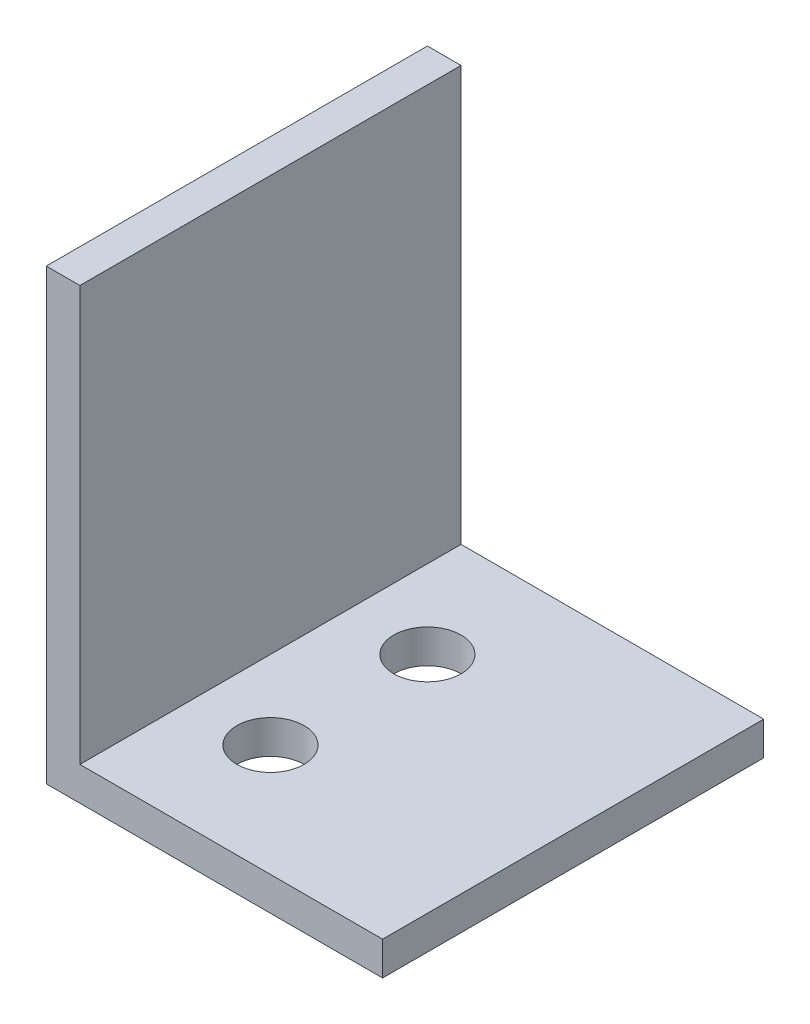
ISO-10303-21;
HEADER;
FILE_DESCRIPTION(('STEP AP214'),'2;1');
FILE_NAME('part.step','',(''),(''),'','','');
FILE_SCHEMA(('AUTOMOTIVE_DESIGN { 1 0 10303 214 1 1 1 1 }'));
ENDSEC;
DATA;
#1=APPLICATION_CONTEXT('core data for automotive mechanical design processes');
#2=APPLICATION_PROTOCOL_DEFINITION('international standard','automotive_design',2000,#1);
#3=PRODUCT_CONTEXT('',#1,'mechanical');
#4=PRODUCT('Part','Part','',(#3));
#5=PRODUCT_RELATED_PRODUCT_CATEGORY('part','',(#4));
#6=PRODUCT_DEFINITION_FORMATION('','',#4);
#7=PRODUCT_DEFINITION_CONTEXT('part definition',#1,'design');
#8=PRODUCT_DEFINITION('design','',#6,#7);
#9=PRODUCT_DEFINITION_SHAPE('','',#8);
#10=(LENGTH_UNIT() NAMED_UNIT(*) SI_UNIT(.MILLI.,.METRE.));
#11=(NAMED_UNIT(*) PLANE_ANGLE_UNIT() SI_UNIT($,.RADIAN.));
#12=(NAMED_UNIT(*) SI_UNIT($,.STERADIAN.) SOLID_ANGLE_UNIT());
#13=UNCERTAINTY_MEASURE_WITH_UNIT(LENGTH_MEASURE(1.E-05),#10,'distance_accuracy_value','');
#14=(GEOMETRIC_REPRESENTATION_CONTEXT(3) GLOBAL_UNCERTAINTY_ASSIGNED_CONTEXT((#13)) GLOBAL_UNIT_ASSIGNED_CONTEXT((#10,
#11,#12)) REPRESENTATION_CONTEXT('',''));
#15=CARTESIAN_POINT('',(0.,0.,0.));
#16=DIRECTION('',(0.,0.,1.));
#17=DIRECTION('',(1.,0.,0.));
#18=AXIS2_PLACEMENT_3D('',#15,#16,#17);
#19=CARTESIAN_POINT('',(-21.6132653272042,4.31884210526316,17.));
#20=DIRECTION('',(0.,-1.,0.));
#21=DIRECTION('',(0.,0.,-1.));
#22=AXIS2_PLACEMENT_3D('',#19,#20,#21);
#23=PLANE('',#22);
#24=DIRECTION('',(-1.,0.,0.));
#25=VECTOR('',#24,1.);
#26=CARTESIAN_POINT('',(-21.6132653272042,4.31884210526316,0.));
#27=LINE('',#26,#25);
#28=CARTESIAN_POINT('',(-21.6132653272042,4.31884210526316,0.));
#29=VERTEX_POINT('',#28);
#30=CARTESIAN_POINT('',(-23.1132653272042,4.31884210526316,0.));
#31=VERTEX_POINT('',#30);
#32=EDGE_CURVE('E114',#29,#31,#27,.T.);
#33=ORIENTED_EDGE('',*,*,#32,.T.);
#34=DIRECTION('',(0.,0.,-1.));
#35=VECTOR('',#34,1.);
#36=CARTESIAN_POINT('',(-23.1132653272042,4.31884210526316,17.));
#37=LINE('',#36,#35);
#38=CARTESIAN_POINT('',(-23.1132653272042,4.31884210526316,17.));
#39=VERTEX_POINT('',#38);
#40=EDGE_CURVE('E11',#39,#31,#37,.T.);
#41=ORIENTED_EDGE('',*,*,#40,.F.);
#42=DIRECTION('',(-1.,0.,0.));
#43=VECTOR('',#42,1.);
#44=CARTESIAN_POINT('',(-21.6132653272042,4.31884210526316,17.));
#45=LINE('',#44,#43);
#46=CARTESIAN_POINT('',(-21.6132653272042,4.31884210526316,17.));
#47=VERTEX_POINT('',#46);
#48=EDGE_CURVE('E125',#47,#39,#45,.T.);
#49=ORIENTED_EDGE('',*,*,#48,.F.);
#50=DIRECTION('',(0.,0.,-1.));
#51=VECTOR('',#50,1.);
#52=CARTESIAN_POINT('',(-21.6132653272042,4.31884210526316,17.));
#53=LINE('',#52,#51);
#54=EDGE_CURVE('E110',#47,#29,#53,.T.);
#55=ORIENTED_EDGE('',*,*,#54,.T.);
#56=EDGE_LOOP('',(#33,#41,#49,#55));
#57=FACE_BOUND('',#56,.T.);
#58=ADVANCED_FACE('F30',(#57),#23,.F.);
#59=CARTESIAN_POINT('',(-23.1132653272042,4.31884210526316,17.));
#60=DIRECTION('',(1.,0.,0.));
#61=DIRECTION('',(0.,1.,0.));
#62=AXIS2_PLACEMENT_3D('',#59,#60,#61);
#63=PLANE('',#62);
#64=DIRECTION('',(0.,-1.,0.));
#65=VECTOR('',#64,1.);
#66=CARTESIAN_POINT('',(-23.1132653272042,4.31884210526316,0.));
#67=LINE('',#66,#65);
#68=CARTESIAN_POINT('',(-23.1132653272042,-15.6811578947368,0.));
#69=VERTEX_POINT('',#68);
#70=EDGE_CURVE('E117',#31,#69,#67,.T.);
#71=ORIENTED_EDGE('',*,*,#70,.T.);
#72=DIRECTION('',(0.,0.,-1.));
#73=VECTOR('',#72,1.);
#74=CARTESIAN_POINT('',(-23.1132653272042,-15.6811578947368,17.));
#75=LINE('',#74,#73);
#76=CARTESIAN_POINT('',(-23.1132653272042,-15.6811578947368,17.));
#77=VERTEX_POINT('',#76);
#78=EDGE_CURVE('E38',#77,#69,#75,.T.);
#79=ORIENTED_EDGE('',*,*,#78,.F.);
#80=DIRECTION('',(0.,-1.,0.));
#81=VECTOR('',#80,1.);
#82=CARTESIAN_POINT('',(-23.1132653272042,4.31884210526316,17.));
#83=LINE('',#82,#81);
#84=EDGE_CURVE('E83',#39,#77,#83,.T.);
#85=ORIENTED_EDGE('',*,*,#84,.F.);
#86=ORIENTED_EDGE('',*,*,#40,.T.);
#87=EDGE_LOOP('',(#71,#79,#85,#86));
#88=FACE_BOUND('',#87,.T.);
#89=ADVANCED_FACE('F150',(#88),#63,.F.);
#90=CARTESIAN_POINT('',(-23.1132653272042,-15.6811578947368,17.));
#91=DIRECTION('',(0.,1.,0.));
#92=DIRECTION('',(0.,0.,1.));
#93=AXIS2_PLACEMENT_3D('',#90,#91,#92);
#94=PLANE('',#93);
#95=CARTESIAN_POINT('',(-18.1132653272042,-15.6811578947368,5.));
#96=DIRECTION('',(0.,1.,0.));
#97=DIRECTION('',(0.,0.,1.));
#98=AXIS2_PLACEMENT_3D('',#95,#96,#97);
#99=CIRCLE('',#98,1.5);
#100=CARTESIAN_POINT('',(-18.1132653272042,-15.6811578947368,6.5));
#101=VERTEX_POINT('',#100);
#102=EDGE_CURVE('E218',#101,#101,#99,.T.);
#103=ORIENTED_EDGE('',*,*,#102,.T.);
#104=EDGE_LOOP('',(#103));
#105=FACE_BOUND('',#104,.T.);
#106=CARTESIAN_POINT('',(-18.1132653272042,-15.6811578947368,12.));
#107=DIRECTION('',(0.,1.,0.));
#108=DIRECTION('',(0.,0.,1.));
#109=AXIS2_PLACEMENT_3D('',#106,#107,#108);
#110=CIRCLE('',#109,1.5);
#111=CARTESIAN_POINT('',(-18.1132653272042,-15.6811578947368,13.5));
#112=VERTEX_POINT('',#111);
#113=EDGE_CURVE('E118',#112,#112,#110,.T.);
#114=ORIENTED_EDGE('',*,*,#113,.T.);
#115=EDGE_LOOP('',(#114));
#116=FACE_BOUND('',#115,.T.);
#117=DIRECTION('',(1.,0.,0.));
#118=VECTOR('',#117,1.);
#119=CARTESIAN_POINT('',(-23.1132653272042,-15.6811578947368,0.));
#120=LINE('',#119,#118);
#121=CARTESIAN_POINT('',(-8.11326532720418,-15.6811578947368,0.));
#122=VERTEX_POINT('',#121);
#123=EDGE_CURVE('E120',#69,#122,#120,.T.);
#124=ORIENTED_EDGE('',*,*,#123,.T.);
#125=DIRECTION('',(0.,0.,-1.));
#126=VECTOR('',#125,1.);
#127=CARTESIAN_POINT('',(-8.11326532720418,-15.6811578947368,17.));
#128=LINE('',#127,#126);
#129=CARTESIAN_POINT('',(-8.11326532720418,-15.6811578947368,17.));
#130=VERTEX_POINT('',#129);
#131=EDGE_CURVE('E105',#130,#122,#128,.T.);
#132=ORIENTED_EDGE('',*,*,#131,.F.);
#133=DIRECTION('',(1.,0.,0.));
#134=VECTOR('',#133,1.);
#135=CARTESIAN_POINT('',(-23.1132653272042,-15.6811578947368,17.));
#136=LINE('',#135,#134);
#137=EDGE_CURVE('E96',#77,#130,#136,.T.);
#138=ORIENTED_EDGE('',*,*,#137,.F.);
#139=ORIENTED_EDGE('',*,*,#78,.T.);
#140=EDGE_LOOP('',(#124,#132,#138,#139));
#141=FACE_BOUND('',#140,.T.);
#142=ADVANCED_FACE('F131',(#105,#116,#141),#94,.F.);
#143=CARTESIAN_POINT('',(-8.11326532720418,-15.6811578947368,17.));
#144=DIRECTION('',(-1.,0.,0.));
#145=DIRECTION('',(0.,0.,1.));
#146=AXIS2_PLACEMENT_3D('',#143,#144,#145);
#147=PLANE('',#146);
#148=DIRECTION('',(0.,1.,0.));
#149=VECTOR('',#148,1.);
#150=CARTESIAN_POINT('',(-8.11326532720418,-15.6811578947368,0.));
#151=LINE('',#150,#149);
#152=CARTESIAN_POINT('',(-8.11326532720418,-14.1811578947368,0.));
#153=VERTEX_POINT('',#152);
#154=EDGE_CURVE('E104',#122,#153,#151,.T.);
#155=ORIENTED_EDGE('',*,*,#154,.T.);
#156=DIRECTION('',(0.,0.,-1.));
#157=VECTOR('',#156,1.);
#158=CARTESIAN_POINT('',(-8.11326532720418,-14.1811578947368,17.));
#159=LINE('',#158,#157);
#160=CARTESIAN_POINT('',(-8.11326532720418,-14.1811578947368,17.));
#161=VERTEX_POINT('',#160);
#162=EDGE_CURVE('E101',#161,#153,#159,.T.);
#163=ORIENTED_EDGE('',*,*,#162,.F.);
#164=DIRECTION('',(0.,1.,0.));
#165=VECTOR('',#164,1.);
#166=CARTESIAN_POINT('',(-8.11326532720418,-15.6811578947368,17.));
#167=LINE('',#166,#165);
#168=EDGE_CURVE('E90',#130,#161,#167,.T.);
#169=ORIENTED_EDGE('',*,*,#168,.F.);
#170=ORIENTED_EDGE('',*,*,#131,.T.);
#171=EDGE_LOOP('',(#155,#163,#169,#170));
#172=FACE_BOUND('',#171,.T.);
#173=ADVANCED_FACE('F102',(#172),#147,.F.);
#174=CARTESIAN_POINT('',(-8.11326532720418,-14.1811578947368,17.));
#175=DIRECTION('',(0.,-1.,0.));
#176=DIRECTION('',(1.,0.,0.));
#177=AXIS2_PLACEMENT_3D('',#174,#175,#176);
#178=PLANE('',#177);
#179=CARTESIAN_POINT('',(-18.1132653272042,-14.1811578947368,5.));
#180=DIRECTION('',(0.,1.,0.));
#181=DIRECTION('',(-1.,0.,0.));
#182=AXIS2_PLACEMENT_3D('',#179,#180,#181);
#183=CIRCLE('',#182,1.5);
#184=CARTESIAN_POINT('',(-19.6132653272042,-14.1811578947368,5.));
#185=VERTEX_POINT('',#184);
#186=EDGE_CURVE('E215',#185,#185,#183,.T.);
#187=ORIENTED_EDGE('',*,*,#186,.F.);
#188=EDGE_LOOP('',(#187));
#189=FACE_BOUND('',#188,.T.);
#190=CARTESIAN_POINT('',(-18.1132653272042,-14.1811578947368,12.));
#191=DIRECTION('',(0.,1.,0.));
#192=DIRECTION('',(-1.,0.,0.));
#193=AXIS2_PLACEMENT_3D('',#190,#191,#192);
#194=CIRCLE('',#193,1.5);
#195=CARTESIAN_POINT('',(-19.6132653272042,-14.1811578947368,12.));
#196=VERTEX_POINT('',#195);
#197=EDGE_CURVE('E219',#196,#196,#194,.T.);
#198=ORIENTED_EDGE('',*,*,#197,.F.);
#199=EDGE_LOOP('',(#198));
#200=FACE_BOUND('',#199,.T.);
#201=DIRECTION('',(-1.,0.,0.));
#202=VECTOR('',#201,1.);
#203=CARTESIAN_POINT('',(-8.11326532720418,-14.1811578947368,0.));
#204=LINE('',#203,#202);
#205=CARTESIAN_POINT('',(-21.6132653272042,-14.1811578947368,0.));
#206=VERTEX_POINT('',#205);
#207=EDGE_CURVE('E69',#153,#206,#204,.T.);
#208=ORIENTED_EDGE('',*,*,#207,.T.);
#209=DIRECTION('',(0.,0.,-1.));
#210=VECTOR('',#209,1.);
#211=CARTESIAN_POINT('',(-21.6132653272042,-14.1811578947368,17.));
#212=LINE('',#211,#210);
#213=CARTESIAN_POINT('',(-21.6132653272042,-14.1811578947368,17.));
#214=VERTEX_POINT('',#213);
#215=EDGE_CURVE('E106',#214,#206,#212,.T.);
#216=ORIENTED_EDGE('',*,*,#215,.F.);
#217=DIRECTION('',(-1.,0.,0.));
#218=VECTOR('',#217,1.);
#219=CARTESIAN_POINT('',(-8.11326532720418,-14.1811578947368,17.));
#220=LINE('',#219,#218);
#221=EDGE_CURVE('E94',#161,#214,#220,.T.);
#222=ORIENTED_EDGE('',*,*,#221,.F.);
#223=ORIENTED_EDGE('',*,*,#162,.T.);
#224=EDGE_LOOP('',(#208,#216,#222,#223));
#225=FACE_BOUND('',#224,.T.);
#226=ADVANCED_FACE('F108',(#189,#200,#225),#178,.F.);
#227=CARTESIAN_POINT('',(-21.6132653272042,-14.1811578947368,17.));
#228=DIRECTION('',(-1.,0.,0.));
#229=DIRECTION('',(0.,0.,1.));
#230=AXIS2_PLACEMENT_3D('',#227,#228,#229);
#231=PLANE('',#230);
#232=DIRECTION('',(0.,1.,0.));
#233=VECTOR('',#232,1.);
#234=CARTESIAN_POINT('',(-21.6132653272042,-14.1811578947368,0.));
#235=LINE('',#234,#233);
#236=EDGE_CURVE('E75',#206,#29,#235,.T.);
#237=ORIENTED_EDGE('',*,*,#236,.T.);
#238=ORIENTED_EDGE('',*,*,#54,.F.);
#239=DIRECTION('',(0.,1.,0.));
#240=VECTOR('',#239,1.);
#241=CARTESIAN_POINT('',(-21.6132653272042,-14.1811578947368,17.));
#242=LINE('',#241,#240);
#243=EDGE_CURVE('E46',#214,#47,#242,.T.);
#244=ORIENTED_EDGE('',*,*,#243,.F.);
#245=ORIENTED_EDGE('',*,*,#215,.T.);
#246=EDGE_LOOP('',(#237,#238,#244,#245));
#247=FACE_BOUND('',#246,.T.);
#248=ADVANCED_FACE('F138',(#247),#231,.F.);
#249=CARTESIAN_POINT('',(-23.1132653272042,4.31884210526316,17.));
#250=DIRECTION('',(0.,0.,1.));
#251=DIRECTION('',(1.,0.,0.));
#252=AXIS2_PLACEMENT_3D('',#249,#250,#251);
#253=PLANE('',#252);
#254=ORIENTED_EDGE('',*,*,#48,.T.);
#255=ORIENTED_EDGE('',*,*,#84,.T.);
#256=ORIENTED_EDGE('',*,*,#137,.T.);
#257=ORIENTED_EDGE('',*,*,#168,.T.);
#258=ORIENTED_EDGE('',*,*,#221,.T.);
#259=ORIENTED_EDGE('',*,*,#243,.T.);
#260=EDGE_LOOP('',(#254,#255,#256,#257,#258,#259));
#261=FACE_BOUND('',#260,.T.);
#262=ADVANCED_FACE('F92',(#261),#253,.T.);
#263=CARTESIAN_POINT('',(-23.1132653272042,4.31884210526316,0.));
#264=DIRECTION('',(0.,0.,1.));
#265=DIRECTION('',(1.,0.,0.));
#266=AXIS2_PLACEMENT_3D('',#263,#264,#265);
#267=PLANE('',#266);
#268=ORIENTED_EDGE('',*,*,#32,.F.);
#269=ORIENTED_EDGE('',*,*,#236,.F.);
#270=ORIENTED_EDGE('',*,*,#207,.F.);
#271=ORIENTED_EDGE('',*,*,#154,.F.);
#272=ORIENTED_EDGE('',*,*,#123,.F.);
#273=ORIENTED_EDGE('',*,*,#70,.F.);
#274=EDGE_LOOP('',(#268,#269,#270,#271,#272,#273));
#275=FACE_BOUND('',#274,.T.);
#276=ADVANCED_FACE('F134',(#275),#267,.F.);
#277=CARTESIAN_POINT('',(-18.1132653272042,-24.1811578947368,12.));
#278=DIRECTION('',(0.,1.,0.));
#279=DIRECTION('',(-1.,0.,0.));
#280=AXIS2_PLACEMENT_3D('',#277,#278,#279);
#281=CYLINDRICAL_SURFACE('',#280,1.5);
#282=ORIENTED_EDGE('',*,*,#197,.T.);
#283=EDGE_LOOP('',(#282));
#284=FACE_BOUND('',#283,.T.);
#285=ORIENTED_EDGE('',*,*,#113,.F.);
#286=EDGE_LOOP('',(#285));
#287=FACE_BOUND('',#286,.T.);
#288=ADVANCED_FACE('F178',(#284,#287),#281,.F.);
#289=CARTESIAN_POINT('',(-18.1132653272042,-24.1811578947368,5.));
#290=DIRECTION('',(0.,1.,0.));
#291=DIRECTION('',(-1.,0.,0.));
#292=AXIS2_PLACEMENT_3D('',#289,#290,#291);
#293=CYLINDRICAL_SURFACE('',#292,1.5);
#294=ORIENTED_EDGE('',*,*,#186,.T.);
#295=EDGE_LOOP('',(#294));
#296=FACE_BOUND('',#295,.T.);
#297=ORIENTED_EDGE('',*,*,#102,.F.);
#298=EDGE_LOOP('',(#297));
#299=FACE_BOUND('',#298,.T.);
#300=ADVANCED_FACE('F183',(#296,#299),#293,.F.);
#301=CLOSED_SHELL('',(#58,#89,#142,#173,#226,#248,#262,#276,#288,#300));
#302=MANIFOLD_SOLID_BREP('B2',#301);
#303=ADVANCED_BREP_SHAPE_REPRESENTATION('',(#18,#302),#14);
#304=SHAPE_DEFINITION_REPRESENTATION(#9,#303);
ENDSEC;
END-ISO-10303-21;
